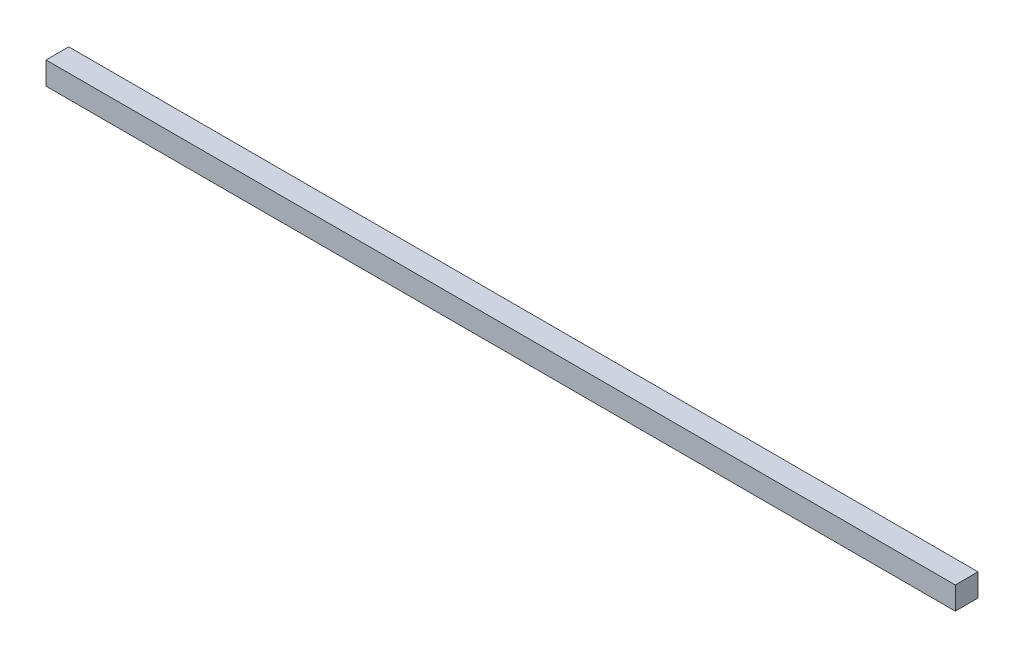
ISO-10303-21;
HEADER;
FILE_DESCRIPTION(('STEP AP214'),'2;1');
FILE_NAME('part.step','',(''),(''),'','','');
FILE_SCHEMA(('AUTOMOTIVE_DESIGN { 1 0 10303 214 1 1 1 1 }'));
ENDSEC;
DATA;
#1=APPLICATION_CONTEXT('core data for automotive mechanical design processes');
#2=APPLICATION_PROTOCOL_DEFINITION('international standard','automotive_design',2000,#1);
#3=PRODUCT_CONTEXT('',#1,'mechanical');
#4=PRODUCT('Part','Part','',(#3));
#5=PRODUCT_RELATED_PRODUCT_CATEGORY('part','',(#4));
#6=PRODUCT_DEFINITION_FORMATION('','',#4);
#7=PRODUCT_DEFINITION_CONTEXT('part definition',#1,'design');
#8=PRODUCT_DEFINITION('design','',#6,#7);
#9=PRODUCT_DEFINITION_SHAPE('','',#8);
#10=(LENGTH_UNIT() NAMED_UNIT(*) SI_UNIT(.MILLI.,.METRE.));
#11=(NAMED_UNIT(*) PLANE_ANGLE_UNIT() SI_UNIT($,.RADIAN.));
#12=(NAMED_UNIT(*) SI_UNIT($,.STERADIAN.) SOLID_ANGLE_UNIT());
#13=UNCERTAINTY_MEASURE_WITH_UNIT(LENGTH_MEASURE(1.E-05),#10,'distance_accuracy_value','');
#14=(GEOMETRIC_REPRESENTATION_CONTEXT(3) GLOBAL_UNCERTAINTY_ASSIGNED_CONTEXT((#13)) GLOBAL_UNIT_ASSIGNED_CONTEXT((#10,
#11,#12)) REPRESENTATION_CONTEXT('',''));
#15=CARTESIAN_POINT('',(0.,0.,0.));
#16=DIRECTION('',(0.,0.,1.));
#17=DIRECTION('',(1.,0.,0.));
#18=AXIS2_PLACEMENT_3D('',#15,#16,#17);
#19=CARTESIAN_POINT('',(0.,10.,10.));
#20=DIRECTION('',(1.,0.,0.));
#21=DIRECTION('',(0.,0.,-1.));
#22=AXIS2_PLACEMENT_3D('',#19,#20,#21);
#23=PLANE('',#22);
#24=DIRECTION('',(0.,0.,1.));
#25=VECTOR('',#24,1.);
#26=CARTESIAN_POINT('',(0.,0.,10.));
#27=LINE('',#26,#25);
#28=CARTESIAN_POINT('',(0.,0.,0.));
#29=VERTEX_POINT('',#28);
#30=CARTESIAN_POINT('',(0.,0.,10.));
#31=VERTEX_POINT('',#30);
#32=EDGE_CURVE('E96',#29,#31,#27,.T.);
#33=ORIENTED_EDGE('',*,*,#32,.T.);
#34=DIRECTION('',(0.,-1.,0.));
#35=VECTOR('',#34,1.);
#36=CARTESIAN_POINT('',(0.,10.,10.));
#37=LINE('',#36,#35);
#38=CARTESIAN_POINT('',(0.,10.,10.));
#39=VERTEX_POINT('',#38);
#40=EDGE_CURVE('E11',#39,#31,#37,.T.);
#41=ORIENTED_EDGE('',*,*,#40,.F.);
#42=DIRECTION('',(0.,0.,1.));
#43=VECTOR('',#42,1.);
#44=CARTESIAN_POINT('',(0.,10.,10.));
#45=LINE('',#44,#43);
#46=CARTESIAN_POINT('',(0.,10.,0.));
#47=VERTEX_POINT('',#46);
#48=EDGE_CURVE('E84',#47,#39,#45,.T.);
#49=ORIENTED_EDGE('',*,*,#48,.F.);
#50=DIRECTION('',(0.,-1.,0.));
#51=VECTOR('',#50,1.);
#52=CARTESIAN_POINT('',(0.,10.,0.));
#53=LINE('',#52,#51);
#54=EDGE_CURVE('E92',#47,#29,#53,.T.);
#55=ORIENTED_EDGE('',*,*,#54,.T.);
#56=EDGE_LOOP('',(#33,#41,#49,#55));
#57=FACE_BOUND('',#56,.T.);
#58=ADVANCED_FACE('F33',(#57),#23,.F.);
#59=CARTESIAN_POINT('',(400.,10.,9.99999999999995));
#60=DIRECTION('',(0.,0.,-1.));
#61=DIRECTION('',(-1.,0.,0.));
#62=AXIS2_PLACEMENT_3D('',#59,#60,#61);
#63=PLANE('',#62);
#64=DIRECTION('',(1.,0.,0.));
#65=VECTOR('',#64,1.);
#66=CARTESIAN_POINT('',(400.,0.,9.99999999999995));
#67=LINE('',#66,#65);
#68=CARTESIAN_POINT('',(400.,0.,9.99999999999995));
#69=VERTEX_POINT('',#68);
#70=EDGE_CURVE('E88',#31,#69,#67,.T.);
#71=ORIENTED_EDGE('',*,*,#70,.T.);
#72=DIRECTION('',(0.,-1.,0.));
#73=VECTOR('',#72,1.);
#74=CARTESIAN_POINT('',(400.,10.,9.99999999999995));
#75=LINE('',#74,#73);
#76=CARTESIAN_POINT('',(400.,10.,9.99999999999995));
#77=VERTEX_POINT('',#76);
#78=EDGE_CURVE('E41',#77,#69,#75,.T.);
#79=ORIENTED_EDGE('',*,*,#78,.F.);
#80=DIRECTION('',(1.,0.,0.));
#81=VECTOR('',#80,1.);
#82=CARTESIAN_POINT('',(400.,10.,9.99999999999995));
#83=LINE('',#82,#81);
#84=EDGE_CURVE('E79',#39,#77,#83,.T.);
#85=ORIENTED_EDGE('',*,*,#84,.F.);
#86=ORIENTED_EDGE('',*,*,#40,.T.);
#87=EDGE_LOOP('',(#71,#79,#85,#86));
#88=FACE_BOUND('',#87,.T.);
#89=ADVANCED_FACE('F87',(#88),#63,.F.);
#90=CARTESIAN_POINT('',(400.,10.,9.99999999999995));
#91=DIRECTION('',(-1.,0.,0.));
#92=DIRECTION('',(0.,0.,1.));
#93=AXIS2_PLACEMENT_3D('',#90,#91,#92);
#94=PLANE('',#93);
#95=DIRECTION('',(0.,0.,-1.));
#96=VECTOR('',#95,1.);
#97=CARTESIAN_POINT('',(400.,0.,9.99999999999995));
#98=LINE('',#97,#96);
#99=CARTESIAN_POINT('',(400.,0.,0.));
#100=VERTEX_POINT('',#99);
#101=EDGE_CURVE('E66',#69,#100,#98,.T.);
#102=ORIENTED_EDGE('',*,*,#101,.T.);
#103=DIRECTION('',(0.,-1.,0.));
#104=VECTOR('',#103,1.);
#105=CARTESIAN_POINT('',(400.,10.,0.));
#106=LINE('',#105,#104);
#107=CARTESIAN_POINT('',(400.,10.,0.));
#108=VERTEX_POINT('',#107);
#109=EDGE_CURVE('E89',#108,#100,#106,.T.);
#110=ORIENTED_EDGE('',*,*,#109,.F.);
#111=DIRECTION('',(0.,0.,-1.));
#112=VECTOR('',#111,1.);
#113=CARTESIAN_POINT('',(400.,10.,9.99999999999995));
#114=LINE('',#113,#112);
#115=EDGE_CURVE('E82',#77,#108,#114,.T.);
#116=ORIENTED_EDGE('',*,*,#115,.F.);
#117=ORIENTED_EDGE('',*,*,#78,.T.);
#118=EDGE_LOOP('',(#102,#110,#116,#117));
#119=FACE_BOUND('',#118,.T.);
#120=ADVANCED_FACE('F90',(#119),#94,.F.);
#121=CARTESIAN_POINT('',(400.,10.,0.));
#122=DIRECTION('',(0.,0.,1.));
#123=DIRECTION('',(1.,0.,0.));
#124=AXIS2_PLACEMENT_3D('',#121,#122,#123);
#125=PLANE('',#124);
#126=DIRECTION('',(-1.,0.,0.));
#127=VECTOR('',#126,1.);
#128=CARTESIAN_POINT('',(400.,0.,0.));
#129=LINE('',#128,#127);
#130=EDGE_CURVE('E72',#100,#29,#129,.T.);
#131=ORIENTED_EDGE('',*,*,#130,.T.);
#132=ORIENTED_EDGE('',*,*,#54,.F.);
#133=DIRECTION('',(-1.,0.,0.));
#134=VECTOR('',#133,1.);
#135=CARTESIAN_POINT('',(400.,10.,0.));
#136=LINE('',#135,#134);
#137=EDGE_CURVE('E49',#108,#47,#136,.T.);
#138=ORIENTED_EDGE('',*,*,#137,.F.);
#139=ORIENTED_EDGE('',*,*,#109,.T.);
#140=EDGE_LOOP('',(#131,#132,#138,#139));
#141=FACE_BOUND('',#140,.T.);
#142=ADVANCED_FACE('F103',(#141),#125,.F.);
#143=CARTESIAN_POINT('',(0.,10.,0.));
#144=DIRECTION('',(0.,1.,0.));
#145=DIRECTION('',(0.,0.,1.));
#146=AXIS2_PLACEMENT_3D('',#143,#144,#145);
#147=PLANE('',#146);
#148=ORIENTED_EDGE('',*,*,#48,.T.);
#149=ORIENTED_EDGE('',*,*,#84,.T.);
#150=ORIENTED_EDGE('',*,*,#115,.T.);
#151=ORIENTED_EDGE('',*,*,#137,.T.);
#152=EDGE_LOOP('',(#148,#149,#150,#151));
#153=FACE_BOUND('',#152,.T.);
#154=ADVANCED_FACE('F80',(#153),#147,.T.);
#155=CARTESIAN_POINT('',(0.,0.,0.));
#156=DIRECTION('',(0.,1.,0.));
#157=DIRECTION('',(0.,0.,1.));
#158=AXIS2_PLACEMENT_3D('',#155,#156,#157);
#159=PLANE('',#158);
#160=ORIENTED_EDGE('',*,*,#32,.F.);
#161=ORIENTED_EDGE('',*,*,#130,.F.);
#162=ORIENTED_EDGE('',*,*,#101,.F.);
#163=ORIENTED_EDGE('',*,*,#70,.F.);
#164=EDGE_LOOP('',(#160,#161,#162,#163));
#165=FACE_BOUND('',#164,.T.);
#166=ADVANCED_FACE('F106',(#165),#159,.F.);
#167=CLOSED_SHELL('',(#58,#89,#120,#142,#154,#166));
#168=MANIFOLD_SOLID_BREP('B2',#167);
#169=ADVANCED_BREP_SHAPE_REPRESENTATION('',(#18,#168),#14);
#170=SHAPE_DEFINITION_REPRESENTATION(#9,#169);
ENDSEC;
END-ISO-10303-21;
